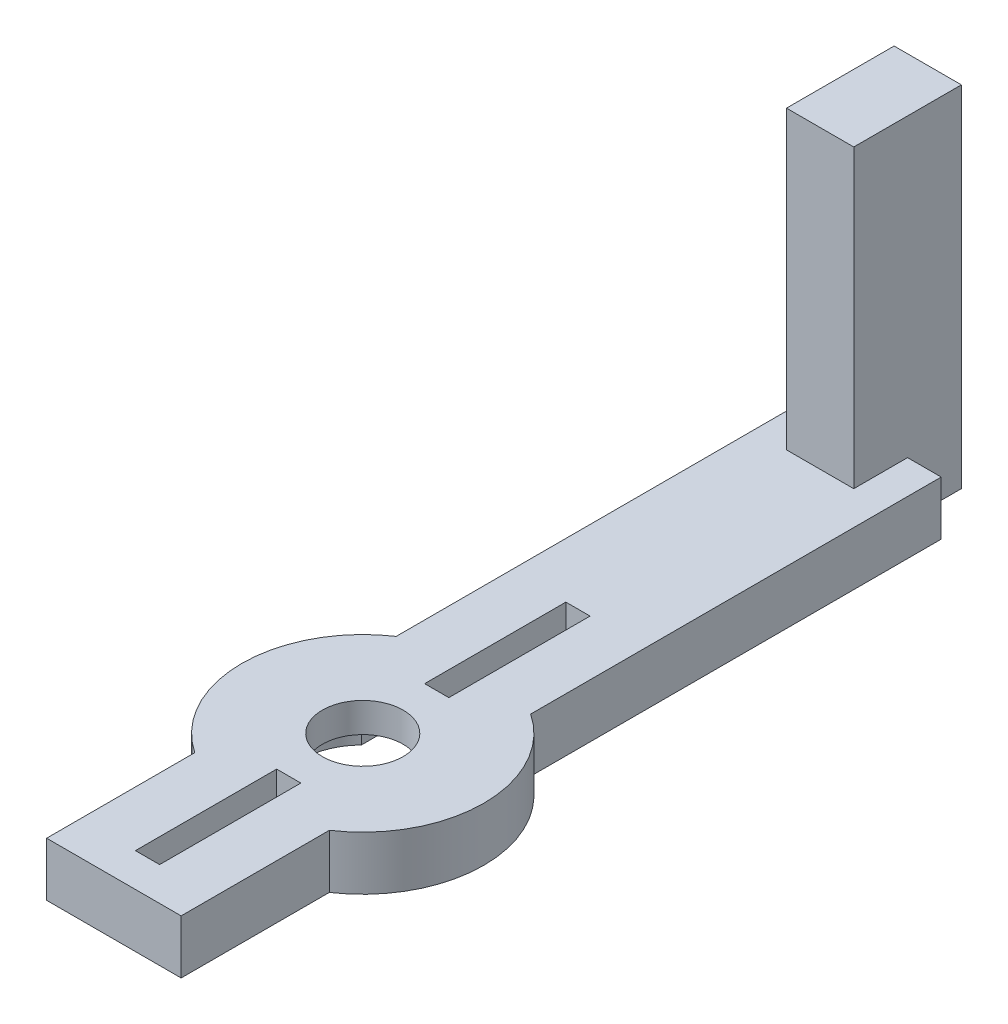
ISO-10303-21;
HEADER;
FILE_DESCRIPTION(('STEP AP214'),'2;1');
FILE_NAME('part.step','',(''),(''),'','','');
FILE_SCHEMA(('AUTOMOTIVE_DESIGN { 1 0 10303 214 1 1 1 1 }'));
ENDSEC;
DATA;
#1=APPLICATION_CONTEXT('core data for automotive mechanical design processes');
#2=APPLICATION_PROTOCOL_DEFINITION('international standard','automotive_design',2000,#1);
#3=PRODUCT_CONTEXT('',#1,'mechanical');
#4=PRODUCT('Part','Part','',(#3));
#5=PRODUCT_RELATED_PRODUCT_CATEGORY('part','',(#4));
#6=PRODUCT_DEFINITION_FORMATION('','',#4);
#7=PRODUCT_DEFINITION_CONTEXT('part definition',#1,'design');
#8=PRODUCT_DEFINITION('design','',#6,#7);
#9=PRODUCT_DEFINITION_SHAPE('','',#8);
#10=(LENGTH_UNIT() NAMED_UNIT(*) SI_UNIT(.MILLI.,.METRE.));
#11=(NAMED_UNIT(*) PLANE_ANGLE_UNIT() SI_UNIT($,.RADIAN.));
#12=(NAMED_UNIT(*) SI_UNIT($,.STERADIAN.) SOLID_ANGLE_UNIT());
#13=UNCERTAINTY_MEASURE_WITH_UNIT(LENGTH_MEASURE(1.E-05),#10,'distance_accuracy_value','');
#14=(GEOMETRIC_REPRESENTATION_CONTEXT(3) GLOBAL_UNCERTAINTY_ASSIGNED_CONTEXT((#13)) GLOBAL_UNIT_ASSIGNED_CONTEXT((#10,
#11,#12)) REPRESENTATION_CONTEXT('',''));
#15=CARTESIAN_POINT('',(0.,0.,0.));
#16=DIRECTION('',(0.,0.,1.));
#17=DIRECTION('',(1.,0.,0.));
#18=AXIS2_PLACEMENT_3D('',#15,#16,#17);
#19=CARTESIAN_POINT('',(0.,67.6,-62.));
#20=DIRECTION('',(0.,1.,0.));
#21=DIRECTION('',(0.,0.,1.));
#22=AXIS2_PLACEMENT_3D('',#19,#20,#21);
#23=PLANE('',#22);
#24=CARTESIAN_POINT('',(0.,67.6,-62.));
#25=DIRECTION('',(0.,1.,0.));
#26=DIRECTION('',(0.,0.,1.));
#27=AXIS2_PLACEMENT_3D('',#24,#25,#26);
#28=CIRCLE('',#27,3.);
#29=CARTESIAN_POINT('',(0.,67.6,-59.));
#30=VERTEX_POINT('',#29);
#31=EDGE_CURVE('E252',#30,#30,#28,.F.);
#32=ORIENTED_EDGE('',*,*,#31,.T.);
#33=EDGE_LOOP('',(#32));
#34=FACE_BOUND('',#33,.T.);
#35=DIRECTION('',(-1.,0.,0.));
#36=VECTOR('',#35,1.);
#37=CARTESIAN_POINT('',(0.,67.6,-96.));
#38=LINE('',#37,#36);
#39=CARTESIAN_POINT('',(2.5,67.6,-96.));
#40=VERTEX_POINT('',#39);
#41=CARTESIAN_POINT('',(-2.5,67.6,-96.));
#42=VERTEX_POINT('',#41);
#43=EDGE_CURVE('E359',#40,#42,#38,.T.);
#44=ORIENTED_EDGE('',*,*,#43,.T.);
#45=DIRECTION('',(0.,0.,-1.));
#46=VECTOR('',#45,1.);
#47=CARTESIAN_POINT('',(-2.5,67.6,-62.));
#48=LINE('',#47,#46);
#49=CARTESIAN_POINT('',(-2.5,67.6,-100.));
#50=VERTEX_POINT('',#49);
#51=EDGE_CURVE('E356',#42,#50,#48,.T.);
#52=ORIENTED_EDGE('',*,*,#51,.T.);
#53=DIRECTION('',(-1.,0.,0.));
#54=VECTOR('',#53,1.);
#55=CARTESIAN_POINT('',(-5.,67.6,-100.));
#56=LINE('',#55,#54);
#57=CARTESIAN_POINT('',(-5.,67.6,-100.));
#58=VERTEX_POINT('',#57);
#59=EDGE_CURVE('E383',#50,#58,#56,.T.);
#60=ORIENTED_EDGE('',*,*,#59,.T.);
#61=DIRECTION('',(0.,0.,-1.));
#62=VECTOR('',#61,1.);
#63=CARTESIAN_POINT('',(-5.,67.6,-43.5));
#64=LINE('',#63,#62);
#65=CARTESIAN_POINT('',(-5.,67.6,-69.4833147735479));
#66=VERTEX_POINT('',#65);
#67=EDGE_CURVE('E373',#66,#58,#64,.T.);
#68=ORIENTED_EDGE('',*,*,#67,.F.);
#69=CARTESIAN_POINT('',(0.,67.6,-62.));
#70=DIRECTION('',(0.,1.,0.));
#71=DIRECTION('',(0.,0.,1.));
#72=AXIS2_PLACEMENT_3D('',#69,#70,#71);
#73=CIRCLE('',#72,9.);
#74=CARTESIAN_POINT('',(-5.,67.6,-54.5166852264521));
#75=VERTEX_POINT('',#74);
#76=EDGE_CURVE('E413',#66,#75,#73,.T.);
#77=ORIENTED_EDGE('',*,*,#76,.T.);
#78=CARTESIAN_POINT('',(-5.,67.6,-43.5));
#79=VERTEX_POINT('',#78);
#80=EDGE_CURVE('E386',#79,#75,#64,.T.);
#81=ORIENTED_EDGE('',*,*,#80,.F.);
#82=DIRECTION('',(-1.,0.,0.));
#83=VECTOR('',#82,1.);
#84=CARTESIAN_POINT('',(-5.,67.6,-43.5));
#85=LINE('',#84,#83);
#86=CARTESIAN_POINT('',(5.,67.6,-43.5));
#87=VERTEX_POINT('',#86);
#88=EDGE_CURVE('E371',#87,#79,#85,.T.);
#89=ORIENTED_EDGE('',*,*,#88,.F.);
#90=DIRECTION('',(0.,0.,-1.));
#91=VECTOR('',#90,1.);
#92=CARTESIAN_POINT('',(5.,67.6,-43.5));
#93=LINE('',#92,#91);
#94=CARTESIAN_POINT('',(5.,67.6,-54.5166852264521));
#95=VERTEX_POINT('',#94);
#96=EDGE_CURVE('E389',#87,#95,#93,.T.);
#97=ORIENTED_EDGE('',*,*,#96,.T.);
#98=CARTESIAN_POINT('',(5.,67.6,-69.4833147735479));
#99=VERTEX_POINT('',#98);
#100=EDGE_CURVE('E409',#95,#99,#73,.T.);
#101=ORIENTED_EDGE('',*,*,#100,.T.);
#102=CARTESIAN_POINT('',(5.,67.6,-100.));
#103=VERTEX_POINT('',#102);
#104=EDGE_CURVE('E388',#99,#103,#93,.T.);
#105=ORIENTED_EDGE('',*,*,#104,.T.);
#106=CARTESIAN_POINT('',(2.5,67.6,-100.));
#107=VERTEX_POINT('',#106);
#108=EDGE_CURVE('E367',#103,#107,#56,.T.);
#109=ORIENTED_EDGE('',*,*,#108,.T.);
#110=DIRECTION('',(0.,0.,1.));
#111=VECTOR('',#110,1.);
#112=CARTESIAN_POINT('',(2.5,67.6,-62.));
#113=LINE('',#112,#111);
#114=EDGE_CURVE('E353',#107,#40,#113,.T.);
#115=ORIENTED_EDGE('',*,*,#114,.T.);
#116=EDGE_LOOP('',(#44,#52,#60,#68,#77,#81,#89,#97,#101,#105,#109,#115));
#117=FACE_BOUND('',#116,.T.);
#118=DIRECTION('',(0.,0.,1.));
#119=VECTOR('',#118,1.);
#120=CARTESIAN_POINT('',(0.9,67.6,-62.));
#121=LINE('',#120,#119);
#122=CARTESIAN_POINT('',(0.9,67.6,-56.5));
#123=VERTEX_POINT('',#122);
#124=CARTESIAN_POINT('',(0.9,67.6,-46.));
#125=VERTEX_POINT('',#124);
#126=EDGE_CURVE('E292',#123,#125,#121,.T.);
#127=ORIENTED_EDGE('',*,*,#126,.T.);
#128=DIRECTION('',(-1.,0.,0.));
#129=VECTOR('',#128,1.);
#130=CARTESIAN_POINT('',(0.,67.6,-46.));
#131=LINE('',#130,#129);
#132=CARTESIAN_POINT('',(-0.9,67.6,-46.));
#133=VERTEX_POINT('',#132);
#134=EDGE_CURVE('E289',#125,#133,#131,.T.);
#135=ORIENTED_EDGE('',*,*,#134,.T.);
#136=DIRECTION('',(0.,0.,-1.));
#137=VECTOR('',#136,1.);
#138=CARTESIAN_POINT('',(-0.9,67.6,-62.));
#139=LINE('',#138,#137);
#140=CARTESIAN_POINT('',(-0.9,67.6,-56.5));
#141=VERTEX_POINT('',#140);
#142=EDGE_CURVE('E295',#133,#141,#139,.T.);
#143=ORIENTED_EDGE('',*,*,#142,.T.);
#144=DIRECTION('',(-1.,0.,0.));
#145=VECTOR('',#144,1.);
#146=CARTESIAN_POINT('',(0.,67.6,-56.5));
#147=LINE('',#146,#145);
#148=EDGE_CURVE('E285',#123,#141,#147,.T.);
#149=ORIENTED_EDGE('',*,*,#148,.F.);
#150=EDGE_LOOP('',(#127,#135,#143,#149));
#151=FACE_BOUND('',#150,.T.);
#152=DIRECTION('',(0.,0.,1.));
#153=VECTOR('',#152,1.);
#154=CARTESIAN_POINT('',(0.9,67.6,-62.));
#155=LINE('',#154,#153);
#156=CARTESIAN_POINT('',(0.9,67.6,-78.));
#157=VERTEX_POINT('',#156);
#158=CARTESIAN_POINT('',(0.9,67.6,-67.5));
#159=VERTEX_POINT('',#158);
#160=EDGE_CURVE('E256',#157,#159,#155,.T.);
#161=ORIENTED_EDGE('',*,*,#160,.T.);
#162=DIRECTION('',(-1.,0.,0.));
#163=VECTOR('',#162,1.);
#164=CARTESIAN_POINT('',(0.,67.6,-67.5));
#165=LINE('',#164,#163);
#166=CARTESIAN_POINT('',(-0.9,67.6,-67.5));
#167=VERTEX_POINT('',#166);
#168=EDGE_CURVE('E242',#159,#167,#165,.T.);
#169=ORIENTED_EDGE('',*,*,#168,.T.);
#170=DIRECTION('',(0.,0.,-1.));
#171=VECTOR('',#170,1.);
#172=CARTESIAN_POINT('',(-0.9,67.6,-62.));
#173=LINE('',#172,#171);
#174=CARTESIAN_POINT('',(-0.9,67.6,-78.));
#175=VERTEX_POINT('',#174);
#176=EDGE_CURVE('E248',#167,#175,#173,.T.);
#177=ORIENTED_EDGE('',*,*,#176,.T.);
#178=DIRECTION('',(-1.,0.,0.));
#179=VECTOR('',#178,1.);
#180=CARTESIAN_POINT('',(0.,67.6,-78.));
#181=LINE('',#180,#179);
#182=EDGE_CURVE('E237',#157,#175,#181,.T.);
#183=ORIENTED_EDGE('',*,*,#182,.F.);
#184=EDGE_LOOP('',(#161,#169,#177,#183));
#185=FACE_BOUND('',#184,.T.);
#186=ADVANCED_FACE('F43',(#34,#117,#151,#185),#23,.T.);
#187=CARTESIAN_POINT('',(0.,65.4,-62.));
#188=DIRECTION('',(0.,1.,0.));
#189=DIRECTION('',(0.,0.,1.));
#190=AXIS2_PLACEMENT_3D('',#187,#188,#189);
#191=PLANE('',#190);
#192=CARTESIAN_POINT('',(0.,65.4,-62.));
#193=DIRECTION('',(0.,1.,0.));
#194=DIRECTION('',(0.,0.,1.));
#195=AXIS2_PLACEMENT_3D('',#192,#193,#194);
#196=CIRCLE('',#195,3.);
#197=CARTESIAN_POINT('',(0.,65.4,-59.));
#198=VERTEX_POINT('',#197);
#199=EDGE_CURVE('E47',#198,#198,#196,.F.);
#200=ORIENTED_EDGE('',*,*,#199,.F.);
#201=EDGE_LOOP('',(#200));
#202=FACE_BOUND('',#201,.T.);
#203=DIRECTION('',(-1.,0.,0.));
#204=VECTOR('',#203,1.);
#205=CARTESIAN_POINT('',(0.,65.4,-46.));
#206=LINE('',#205,#204);
#207=CARTESIAN_POINT('',(0.9,65.4,-46.));
#208=VERTEX_POINT('',#207);
#209=CARTESIAN_POINT('',(-0.9,65.4,-46.));
#210=VERTEX_POINT('',#209);
#211=EDGE_CURVE('E434',#208,#210,#206,.T.);
#212=ORIENTED_EDGE('',*,*,#211,.F.);
#213=DIRECTION('',(0.,0.,1.));
#214=VECTOR('',#213,1.);
#215=CARTESIAN_POINT('',(0.9,65.4,-62.));
#216=LINE('',#215,#214);
#217=CARTESIAN_POINT('',(0.9,65.4,-56.5));
#218=VERTEX_POINT('',#217);
#219=EDGE_CURVE('E429',#218,#208,#216,.T.);
#220=ORIENTED_EDGE('',*,*,#219,.F.);
#221=DIRECTION('',(-1.,0.,0.));
#222=VECTOR('',#221,1.);
#223=CARTESIAN_POINT('',(0.,65.4,-56.5));
#224=LINE('',#223,#222);
#225=CARTESIAN_POINT('',(-0.9,65.4,-56.5));
#226=VERTEX_POINT('',#225);
#227=EDGE_CURVE('E426',#218,#226,#224,.T.);
#228=ORIENTED_EDGE('',*,*,#227,.T.);
#229=DIRECTION('',(0.,0.,-1.));
#230=VECTOR('',#229,1.);
#231=CARTESIAN_POINT('',(-0.9,65.4,-62.));
#232=LINE('',#231,#230);
#233=EDGE_CURVE('E431',#210,#226,#232,.T.);
#234=ORIENTED_EDGE('',*,*,#233,.F.);
#235=EDGE_LOOP('',(#212,#220,#228,#234));
#236=FACE_BOUND('',#235,.T.);
#237=CARTESIAN_POINT('',(0.,65.4,-62.));
#238=DIRECTION('',(0.,1.,0.));
#239=DIRECTION('',(0.,0.,1.));
#240=AXIS2_PLACEMENT_3D('',#237,#238,#239);
#241=CIRCLE('',#240,4.6);
#242=CARTESIAN_POINT('',(-3.3,65.4,-65.2046840717924));
#243=VERTEX_POINT('',#242);
#244=CARTESIAN_POINT('',(-3.3,65.4,-58.7953159282076));
#245=VERTEX_POINT('',#244);
#246=EDGE_CURVE('E320',#243,#245,#241,.T.);
#247=ORIENTED_EDGE('',*,*,#246,.F.);
#248=DIRECTION('',(0.,0.,-1.));
#249=VECTOR('',#248,1.);
#250=CARTESIAN_POINT('',(-3.3,65.4,-62.));
#251=LINE('',#250,#249);
#252=CARTESIAN_POINT('',(-3.3,65.4,-79.5));
#253=VERTEX_POINT('',#252);
#254=EDGE_CURVE('E268',#243,#253,#251,.T.);
#255=ORIENTED_EDGE('',*,*,#254,.T.);
#256=DIRECTION('',(-1.,0.,0.));
#257=VECTOR('',#256,1.);
#258=CARTESIAN_POINT('',(-3.3,65.4,-79.5));
#259=LINE('',#258,#257);
#260=CARTESIAN_POINT('',(3.3,65.4,-79.5));
#261=VERTEX_POINT('',#260);
#262=EDGE_CURVE('E265',#261,#253,#259,.T.);
#263=ORIENTED_EDGE('',*,*,#262,.F.);
#264=DIRECTION('',(0.,0.,-1.));
#265=VECTOR('',#264,1.);
#266=CARTESIAN_POINT('',(3.3,65.4,-62.));
#267=LINE('',#266,#265);
#268=CARTESIAN_POINT('',(3.3,65.4,-65.2046840717924));
#269=VERTEX_POINT('',#268);
#270=EDGE_CURVE('E270',#269,#261,#267,.T.);
#271=ORIENTED_EDGE('',*,*,#270,.F.);
#272=CARTESIAN_POINT('',(3.3,65.4,-58.7953159282076));
#273=VERTEX_POINT('',#272);
#274=EDGE_CURVE('E321',#273,#269,#241,.T.);
#275=ORIENTED_EDGE('',*,*,#274,.F.);
#276=DIRECTION('',(0.,0.,-1.));
#277=VECTOR('',#276,1.);
#278=CARTESIAN_POINT('',(3.3,65.4,-44.5));
#279=LINE('',#278,#277);
#280=CARTESIAN_POINT('',(3.3,65.4,-44.5));
#281=VERTEX_POINT('',#280);
#282=EDGE_CURVE('E308',#281,#273,#279,.T.);
#283=ORIENTED_EDGE('',*,*,#282,.F.);
#284=DIRECTION('',(-1.,0.,0.));
#285=VECTOR('',#284,1.);
#286=CARTESIAN_POINT('',(-3.3,65.4,-44.5));
#287=LINE('',#286,#285);
#288=CARTESIAN_POINT('',(-3.3,65.4,-44.5));
#289=VERTEX_POINT('',#288);
#290=EDGE_CURVE('E303',#281,#289,#287,.T.);
#291=ORIENTED_EDGE('',*,*,#290,.T.);
#292=DIRECTION('',(0.,0.,-1.));
#293=VECTOR('',#292,1.);
#294=CARTESIAN_POINT('',(-3.3,65.4,-44.5));
#295=LINE('',#294,#293);
#296=EDGE_CURVE('E305',#289,#245,#295,.T.);
#297=ORIENTED_EDGE('',*,*,#296,.T.);
#298=EDGE_LOOP('',(#247,#255,#263,#271,#275,#283,#291,#297));
#299=FACE_BOUND('',#298,.T.);
#300=DIRECTION('',(-1.,0.,0.));
#301=VECTOR('',#300,1.);
#302=CARTESIAN_POINT('',(0.,65.4,-67.5));
#303=LINE('',#302,#301);
#304=CARTESIAN_POINT('',(0.9,65.4,-67.5));
#305=VERTEX_POINT('',#304);
#306=CARTESIAN_POINT('',(-0.9,65.4,-67.5));
#307=VERTEX_POINT('',#306);
#308=EDGE_CURVE('E11',#305,#307,#303,.T.);
#309=ORIENTED_EDGE('',*,*,#308,.F.);
#310=DIRECTION('',(0.,0.,1.));
#311=VECTOR('',#310,1.);
#312=CARTESIAN_POINT('',(0.9,65.4,-62.));
#313=LINE('',#312,#311);
#314=CARTESIAN_POINT('',(0.9,65.4,-78.));
#315=VERTEX_POINT('',#314);
#316=EDGE_CURVE('E447',#315,#305,#313,.T.);
#317=ORIENTED_EDGE('',*,*,#316,.F.);
#318=DIRECTION('',(-1.,0.,0.));
#319=VECTOR('',#318,1.);
#320=CARTESIAN_POINT('',(0.,65.4,-78.));
#321=LINE('',#320,#319);
#322=CARTESIAN_POINT('',(-0.9,65.4,-78.));
#323=VERTEX_POINT('',#322);
#324=EDGE_CURVE('E445',#315,#323,#321,.T.);
#325=ORIENTED_EDGE('',*,*,#324,.T.);
#326=DIRECTION('',(0.,0.,-1.));
#327=VECTOR('',#326,1.);
#328=CARTESIAN_POINT('',(-0.9,65.4,-62.));
#329=LINE('',#328,#327);
#330=EDGE_CURVE('E52',#307,#323,#329,.T.);
#331=ORIENTED_EDGE('',*,*,#330,.F.);
#332=EDGE_LOOP('',(#309,#317,#325,#331));
#333=FACE_BOUND('',#332,.T.);
#334=ADVANCED_FACE('F460',(#202,#236,#299,#333),#191,.F.);
#335=CARTESIAN_POINT('',(0.,63.6,-62.));
#336=DIRECTION('',(0.,1.,0.));
#337=DIRECTION('',(0.,0.,1.));
#338=AXIS2_PLACEMENT_3D('',#335,#336,#337);
#339=PLANE('',#338);
#340=DIRECTION('',(1.,0.,0.));
#341=VECTOR('',#340,1.);
#342=CARTESIAN_POINT('',(-5.,63.6,-100.));
#343=LINE('',#342,#341);
#344=CARTESIAN_POINT('',(-5.,63.6,-100.));
#345=VERTEX_POINT('',#344);
#346=CARTESIAN_POINT('',(-2.5,63.6,-100.));
#347=VERTEX_POINT('',#346);
#348=EDGE_CURVE('E377',#345,#347,#343,.T.);
#349=ORIENTED_EDGE('',*,*,#348,.T.);
#350=DIRECTION('',(0.,0.,-1.));
#351=VECTOR('',#350,1.);
#352=CARTESIAN_POINT('',(-2.5,63.6,-96.));
#353=LINE('',#352,#351);
#354=CARTESIAN_POINT('',(-2.5,63.6,-104.));
#355=VERTEX_POINT('',#354);
#356=EDGE_CURVE('E351',#347,#355,#353,.T.);
#357=ORIENTED_EDGE('',*,*,#356,.T.);
#358=DIRECTION('',(1.,0.,0.));
#359=VECTOR('',#358,1.);
#360=CARTESIAN_POINT('',(-2.5,63.6,-104.));
#361=LINE('',#360,#359);
#362=CARTESIAN_POINT('',(2.5,63.6,-104.));
#363=VERTEX_POINT('',#362);
#364=EDGE_CURVE('E337',#355,#363,#361,.T.);
#365=ORIENTED_EDGE('',*,*,#364,.T.);
#366=DIRECTION('',(0.,0.,-1.));
#367=VECTOR('',#366,1.);
#368=CARTESIAN_POINT('',(2.5,63.6,-96.));
#369=LINE('',#368,#367);
#370=CARTESIAN_POINT('',(2.5,63.6,-100.));
#371=VERTEX_POINT('',#370);
#372=EDGE_CURVE('E349',#371,#363,#369,.T.);
#373=ORIENTED_EDGE('',*,*,#372,.F.);
#374=CARTESIAN_POINT('',(5.,63.6,-100.));
#375=VERTEX_POINT('',#374);
#376=EDGE_CURVE('E376',#371,#375,#343,.T.);
#377=ORIENTED_EDGE('',*,*,#376,.T.);
#378=DIRECTION('',(0.,0.,-1.));
#379=VECTOR('',#378,1.);
#380=CARTESIAN_POINT('',(5.,63.6,-43.5));
#381=LINE('',#380,#379);
#382=CARTESIAN_POINT('',(5.,63.6,-69.4833147735479));
#383=VERTEX_POINT('',#382);
#384=EDGE_CURVE('E391',#383,#375,#381,.T.);
#385=ORIENTED_EDGE('',*,*,#384,.F.);
#386=CARTESIAN_POINT('',(0.,63.6,-62.));
#387=DIRECTION('',(0.,1.,0.));
#388=DIRECTION('',(0.,0.,1.));
#389=AXIS2_PLACEMENT_3D('',#386,#387,#388);
#390=CIRCLE('',#389,9.);
#391=CARTESIAN_POINT('',(5.,63.6,-54.5166852264521));
#392=VERTEX_POINT('',#391);
#393=EDGE_CURVE('E414',#392,#383,#390,.T.);
#394=ORIENTED_EDGE('',*,*,#393,.F.);
#395=CARTESIAN_POINT('',(5.,63.6,-43.5));
#396=VERTEX_POINT('',#395);
#397=EDGE_CURVE('E392',#396,#392,#381,.T.);
#398=ORIENTED_EDGE('',*,*,#397,.F.);
#399=DIRECTION('',(1.,0.,0.));
#400=VECTOR('',#399,1.);
#401=CARTESIAN_POINT('',(-5.,63.6,-43.5));
#402=LINE('',#401,#400);
#403=CARTESIAN_POINT('',(-5.,63.6,-43.5));
#404=VERTEX_POINT('',#403);
#405=EDGE_CURVE('E366',#404,#396,#402,.T.);
#406=ORIENTED_EDGE('',*,*,#405,.F.);
#407=DIRECTION('',(0.,0.,-1.));
#408=VECTOR('',#407,1.);
#409=CARTESIAN_POINT('',(-5.,63.6,-43.5));
#410=LINE('',#409,#408);
#411=CARTESIAN_POINT('',(-5.,63.6,-54.5166852264521));
#412=VERTEX_POINT('',#411);
#413=EDGE_CURVE('E395',#404,#412,#410,.T.);
#414=ORIENTED_EDGE('',*,*,#413,.T.);
#415=CARTESIAN_POINT('',(-5.,63.6,-69.4833147735479));
#416=VERTEX_POINT('',#415);
#417=EDGE_CURVE('E408',#416,#412,#390,.T.);
#418=ORIENTED_EDGE('',*,*,#417,.F.);
#419=EDGE_CURVE('E394',#416,#345,#410,.T.);
#420=ORIENTED_EDGE('',*,*,#419,.T.);
#421=EDGE_LOOP('',(#349,#357,#365,#373,#377,#385,#394,#398,#406,#414,#418,#420));
#422=FACE_BOUND('',#421,.T.);
#423=DIRECTION('',(0.,0.,-1.));
#424=VECTOR('',#423,1.);
#425=CARTESIAN_POINT('',(-3.3,63.6,-62.));
#426=LINE('',#425,#424);
#427=CARTESIAN_POINT('',(-3.3,63.6,-65.2046840717924));
#428=VERTEX_POINT('',#427);
#429=CARTESIAN_POINT('',(-3.3,63.6,-79.5));
#430=VERTEX_POINT('',#429);
#431=EDGE_CURVE('E275',#428,#430,#426,.T.);
#432=ORIENTED_EDGE('',*,*,#431,.F.);
#433=CARTESIAN_POINT('',(0.,63.6,-62.));
#434=DIRECTION('',(0.,1.,0.));
#435=DIRECTION('',(0.,0.,1.));
#436=AXIS2_PLACEMENT_3D('',#433,#434,#435);
#437=CIRCLE('',#436,4.6);
#438=CARTESIAN_POINT('',(-3.3,63.6,-58.7953159282076));
#439=VERTEX_POINT('',#438);
#440=EDGE_CURVE('E338',#439,#428,#437,.F.);
#441=ORIENTED_EDGE('',*,*,#440,.F.);
#442=DIRECTION('',(0.,0.,-1.));
#443=VECTOR('',#442,1.);
#444=CARTESIAN_POINT('',(-3.3,63.6,-62.));
#445=LINE('',#444,#443);
#446=CARTESIAN_POINT('',(-3.3,63.6,-44.5));
#447=VERTEX_POINT('',#446);
#448=EDGE_CURVE('E318',#447,#439,#445,.T.);
#449=ORIENTED_EDGE('',*,*,#448,.F.);
#450=DIRECTION('',(-1.,0.,0.));
#451=VECTOR('',#450,1.);
#452=CARTESIAN_POINT('',(0.,63.6,-44.5));
#453=LINE('',#452,#451);
#454=CARTESIAN_POINT('',(3.3,63.6,-44.5));
#455=VERTEX_POINT('',#454);
#456=EDGE_CURVE('E422',#455,#447,#453,.T.);
#457=ORIENTED_EDGE('',*,*,#456,.F.);
#458=DIRECTION('',(0.,0.,1.));
#459=VECTOR('',#458,1.);
#460=CARTESIAN_POINT('',(3.3,63.6,-62.));
#461=LINE('',#460,#459);
#462=CARTESIAN_POINT('',(3.3,63.6,-58.7953159282076));
#463=VERTEX_POINT('',#462);
#464=EDGE_CURVE('E313',#463,#455,#461,.T.);
#465=ORIENTED_EDGE('',*,*,#464,.F.);
#466=CARTESIAN_POINT('',(3.3,63.6,-65.2046840717924));
#467=VERTEX_POINT('',#466);
#468=EDGE_CURVE('E324',#467,#463,#437,.F.);
#469=ORIENTED_EDGE('',*,*,#468,.F.);
#470=DIRECTION('',(0.,0.,1.));
#471=VECTOR('',#470,1.);
#472=CARTESIAN_POINT('',(3.3,63.6,-62.));
#473=LINE('',#472,#471);
#474=CARTESIAN_POINT('',(3.3,63.6,-79.5));
#475=VERTEX_POINT('',#474);
#476=EDGE_CURVE('E273',#475,#467,#473,.T.);
#477=ORIENTED_EDGE('',*,*,#476,.F.);
#478=DIRECTION('',(-1.,0.,0.));
#479=VECTOR('',#478,1.);
#480=CARTESIAN_POINT('',(0.,63.6,-79.5));
#481=LINE('',#480,#479);
#482=EDGE_CURVE('E442',#475,#430,#481,.T.);
#483=ORIENTED_EDGE('',*,*,#482,.T.);
#484=EDGE_LOOP('',(#432,#441,#449,#457,#465,#469,#477,#483));
#485=FACE_BOUND('',#484,.T.);
#486=ADVANCED_FACE('F462',(#422,#485),#339,.F.);
#487=CARTESIAN_POINT('',(0.,65.4,-62.));
#488=DIRECTION('',(0.,-1.,0.));
#489=DIRECTION('',(0.,0.,-1.));
#490=AXIS2_PLACEMENT_3D('',#487,#488,#489);
#491=CYLINDRICAL_SURFACE('',#490,4.6);
#492=ORIENTED_EDGE('',*,*,#440,.T.);
#493=DIRECTION('',(0.,-1.,0.));
#494=VECTOR('',#493,1.);
#495=CARTESIAN_POINT('',(-3.3,65.4,-65.2046840717924));
#496=LINE('',#495,#494);
#497=EDGE_CURVE('E439',#428,#243,#496,.F.);
#498=ORIENTED_EDGE('',*,*,#497,.T.);
#499=ORIENTED_EDGE('',*,*,#246,.T.);
#500=DIRECTION('',(0.,-1.,0.));
#501=VECTOR('',#500,1.);
#502=CARTESIAN_POINT('',(-3.3,65.4,-58.7953159282076));
#503=LINE('',#502,#501);
#504=EDGE_CURVE('E315',#245,#439,#503,.T.);
#505=ORIENTED_EDGE('',*,*,#504,.T.);
#506=EDGE_LOOP('',(#492,#498,#499,#505));
#507=FACE_BOUND('',#506,.T.);
#508=ADVANCED_FACE('F469',(#507),#491,.F.);
#509=ORIENTED_EDGE('',*,*,#274,.T.);
#510=DIRECTION('',(0.,-1.,0.));
#511=VECTOR('',#510,1.);
#512=CARTESIAN_POINT('',(3.3,65.4,-65.2046840717924));
#513=LINE('',#512,#511);
#514=EDGE_CURVE('E436',#269,#467,#513,.T.);
#515=ORIENTED_EDGE('',*,*,#514,.T.);
#516=ORIENTED_EDGE('',*,*,#468,.T.);
#517=DIRECTION('',(0.,-1.,0.));
#518=VECTOR('',#517,1.);
#519=CARTESIAN_POINT('',(3.3,65.4,-58.7953159282076));
#520=LINE('',#519,#518);
#521=EDGE_CURVE('E310',#463,#273,#520,.F.);
#522=ORIENTED_EDGE('',*,*,#521,.T.);
#523=EDGE_LOOP('',(#509,#515,#516,#522));
#524=FACE_BOUND('',#523,.T.);
#525=ADVANCED_FACE('F481',(#524),#491,.F.);
#526=CARTESIAN_POINT('',(0.,0.,-100.));
#527=DIRECTION('',(0.,0.,-1.));
#528=DIRECTION('',(-1.,0.,0.));
#529=AXIS2_PLACEMENT_3D('',#526,#527,#528);
#530=PLANE('',#529);
#531=ORIENTED_EDGE('',*,*,#59,.F.);
#532=DIRECTION('',(0.,-1.,0.));
#533=VECTOR('',#532,1.);
#534=CARTESIAN_POINT('',(-2.5,0.,-100.));
#535=LINE('',#534,#533);
#536=EDGE_CURVE('E419',#50,#347,#535,.T.);
#537=ORIENTED_EDGE('',*,*,#536,.T.);
#538=ORIENTED_EDGE('',*,*,#348,.F.);
#539=DIRECTION('',(0.,-1.,0.));
#540=VECTOR('',#539,1.);
#541=CARTESIAN_POINT('',(-5.,63.6,-100.));
#542=LINE('',#541,#540);
#543=EDGE_CURVE('E362',#58,#345,#542,.T.);
#544=ORIENTED_EDGE('',*,*,#543,.F.);
#545=EDGE_LOOP('',(#531,#537,#538,#544));
#546=FACE_BOUND('',#545,.T.);
#547=ADVANCED_FACE('F509',(#546),#530,.T.);
#548=ORIENTED_EDGE('',*,*,#376,.F.);
#549=DIRECTION('',(0.,1.,0.));
#550=VECTOR('',#549,1.);
#551=CARTESIAN_POINT('',(2.5,0.,-100.));
#552=LINE('',#551,#550);
#553=EDGE_CURVE('E412',#371,#107,#552,.T.);
#554=ORIENTED_EDGE('',*,*,#553,.T.);
#555=ORIENTED_EDGE('',*,*,#108,.F.);
#556=DIRECTION('',(0.,1.,0.));
#557=VECTOR('',#556,1.);
#558=CARTESIAN_POINT('',(5.,63.6,-100.));
#559=LINE('',#558,#557);
#560=EDGE_CURVE('E380',#375,#103,#559,.T.);
#561=ORIENTED_EDGE('',*,*,#560,.F.);
#562=EDGE_LOOP('',(#548,#554,#555,#561));
#563=FACE_BOUND('',#562,.T.);
#564=ADVANCED_FACE('F512',(#563),#530,.T.);
#565=CARTESIAN_POINT('',(0.,67.6,-62.));
#566=DIRECTION('',(0.,-1.,0.));
#567=DIRECTION('',(0.,0.,-1.));
#568=AXIS2_PLACEMENT_3D('',#565,#566,#567);
#569=CYLINDRICAL_SURFACE('',#568,9.);
#570=DIRECTION('',(0.,-1.,0.));
#571=VECTOR('',#570,1.);
#572=CARTESIAN_POINT('',(-5.,67.6,-54.5166852264521));
#573=LINE('',#572,#571);
#574=EDGE_CURVE('E406',#75,#412,#573,.T.);
#575=ORIENTED_EDGE('',*,*,#574,.F.);
#576=ORIENTED_EDGE('',*,*,#76,.F.);
#577=DIRECTION('',(0.,-1.,0.));
#578=VECTOR('',#577,1.);
#579=CARTESIAN_POINT('',(-5.,67.6,-69.4833147735479));
#580=LINE('',#579,#578);
#581=EDGE_CURVE('E403',#416,#66,#580,.F.);
#582=ORIENTED_EDGE('',*,*,#581,.F.);
#583=ORIENTED_EDGE('',*,*,#417,.T.);
#584=EDGE_LOOP('',(#575,#576,#582,#583));
#585=FACE_BOUND('',#584,.T.);
#586=ADVANCED_FACE('F45',(#585),#569,.T.);
#587=DIRECTION('',(0.,-1.,0.));
#588=VECTOR('',#587,1.);
#589=CARTESIAN_POINT('',(5.,67.6,-69.4833147735479));
#590=LINE('',#589,#588);
#591=EDGE_CURVE('E401',#99,#383,#590,.T.);
#592=ORIENTED_EDGE('',*,*,#591,.F.);
#593=ORIENTED_EDGE('',*,*,#100,.F.);
#594=DIRECTION('',(0.,-1.,0.));
#595=VECTOR('',#594,1.);
#596=CARTESIAN_POINT('',(5.,67.6,-54.5166852264521));
#597=LINE('',#596,#595);
#598=EDGE_CURVE('E398',#392,#95,#597,.F.);
#599=ORIENTED_EDGE('',*,*,#598,.F.);
#600=ORIENTED_EDGE('',*,*,#393,.T.);
#601=EDGE_LOOP('',(#592,#593,#599,#600));
#602=FACE_BOUND('',#601,.T.);
#603=ADVANCED_FACE('F518',(#602),#569,.T.);
#604=CARTESIAN_POINT('',(5.,63.6,-43.5));
#605=DIRECTION('',(-1.,0.,0.));
#606=DIRECTION('',(0.,0.,1.));
#607=AXIS2_PLACEMENT_3D('',#604,#605,#606);
#608=PLANE('',#607);
#609=ORIENTED_EDGE('',*,*,#104,.F.);
#610=ORIENTED_EDGE('',*,*,#591,.T.);
#611=ORIENTED_EDGE('',*,*,#384,.T.);
#612=ORIENTED_EDGE('',*,*,#560,.T.);
#613=EDGE_LOOP('',(#609,#610,#611,#612));
#614=FACE_BOUND('',#613,.T.);
#615=ADVANCED_FACE('F514',(#614),#608,.F.);
#616=CARTESIAN_POINT('',(-5.,63.6,-43.5));
#617=DIRECTION('',(1.,0.,0.));
#618=DIRECTION('',(0.,0.,-1.));
#619=AXIS2_PLACEMENT_3D('',#616,#617,#618);
#620=PLANE('',#619);
#621=ORIENTED_EDGE('',*,*,#419,.F.);
#622=ORIENTED_EDGE('',*,*,#581,.T.);
#623=ORIENTED_EDGE('',*,*,#67,.T.);
#624=ORIENTED_EDGE('',*,*,#543,.T.);
#625=EDGE_LOOP('',(#621,#622,#623,#624));
#626=FACE_BOUND('',#625,.T.);
#627=ADVANCED_FACE('F517',(#626),#620,.F.);
#628=ORIENTED_EDGE('',*,*,#80,.T.);
#629=ORIENTED_EDGE('',*,*,#574,.T.);
#630=ORIENTED_EDGE('',*,*,#413,.F.);
#631=DIRECTION('',(0.,-1.,0.));
#632=VECTOR('',#631,1.);
#633=CARTESIAN_POINT('',(-5.,63.6,-43.5));
#634=LINE('',#633,#632);
#635=EDGE_CURVE('E363',#79,#404,#634,.T.);
#636=ORIENTED_EDGE('',*,*,#635,.F.);
#637=EDGE_LOOP('',(#628,#629,#630,#636));
#638=FACE_BOUND('',#637,.T.);
#639=ADVANCED_FACE('F520',(#638),#620,.F.);
#640=ORIENTED_EDGE('',*,*,#397,.T.);
#641=ORIENTED_EDGE('',*,*,#598,.T.);
#642=ORIENTED_EDGE('',*,*,#96,.F.);
#643=DIRECTION('',(0.,1.,0.));
#644=VECTOR('',#643,1.);
#645=CARTESIAN_POINT('',(5.,63.6,-43.5));
#646=LINE('',#645,#644);
#647=EDGE_CURVE('E369',#396,#87,#646,.T.);
#648=ORIENTED_EDGE('',*,*,#647,.F.);
#649=EDGE_LOOP('',(#640,#641,#642,#648));
#650=FACE_BOUND('',#649,.T.);
#651=ADVANCED_FACE('F507',(#650),#608,.F.);
#652=CARTESIAN_POINT('',(0.,0.,-43.5));
#653=DIRECTION('',(0.,0.,-1.));
#654=DIRECTION('',(-1.,0.,0.));
#655=AXIS2_PLACEMENT_3D('',#652,#653,#654);
#656=PLANE('',#655);
#657=ORIENTED_EDGE('',*,*,#635,.T.);
#658=ORIENTED_EDGE('',*,*,#405,.T.);
#659=ORIENTED_EDGE('',*,*,#647,.T.);
#660=ORIENTED_EDGE('',*,*,#88,.T.);
#661=EDGE_LOOP('',(#657,#658,#659,#660));
#662=FACE_BOUND('',#661,.T.);
#663=ADVANCED_FACE('F503',(#662),#656,.F.);
#664=CARTESIAN_POINT('',(-2.5,63.6,-96.));
#665=DIRECTION('',(1.,0.,0.));
#666=DIRECTION('',(0.,0.,-1.));
#667=AXIS2_PLACEMENT_3D('',#664,#665,#666);
#668=PLANE('',#667);
#669=ORIENTED_EDGE('',*,*,#51,.F.);
#670=DIRECTION('',(0.,-1.,0.));
#671=VECTOR('',#670,1.);
#672=CARTESIAN_POINT('',(-2.5,63.6,-96.));
#673=LINE('',#672,#671);
#674=CARTESIAN_POINT('',(-2.5,89.6,-96.));
#675=VERTEX_POINT('',#674);
#676=EDGE_CURVE('E325',#675,#42,#673,.T.);
#677=ORIENTED_EDGE('',*,*,#676,.F.);
#678=DIRECTION('',(0.,0.,-1.));
#679=VECTOR('',#678,1.);
#680=CARTESIAN_POINT('',(-2.5,89.6,-96.));
#681=LINE('',#680,#679);
#682=CARTESIAN_POINT('',(-2.5,89.6,-104.));
#683=VERTEX_POINT('',#682);
#684=EDGE_CURVE('E333',#675,#683,#681,.T.);
#685=ORIENTED_EDGE('',*,*,#684,.T.);
#686=DIRECTION('',(0.,-1.,0.));
#687=VECTOR('',#686,1.);
#688=CARTESIAN_POINT('',(-2.5,63.6,-104.));
#689=LINE('',#688,#687);
#690=EDGE_CURVE('E334',#683,#355,#689,.T.);
#691=ORIENTED_EDGE('',*,*,#690,.T.);
#692=ORIENTED_EDGE('',*,*,#356,.F.);
#693=ORIENTED_EDGE('',*,*,#536,.F.);
#694=EDGE_LOOP('',(#669,#677,#685,#691,#692,#693));
#695=FACE_BOUND('',#694,.T.);
#696=ADVANCED_FACE('F499',(#695),#668,.F.);
#697=CARTESIAN_POINT('',(2.5,63.6,-96.));
#698=DIRECTION('',(-1.,0.,0.));
#699=DIRECTION('',(0.,0.,1.));
#700=AXIS2_PLACEMENT_3D('',#697,#698,#699);
#701=PLANE('',#700);
#702=ORIENTED_EDGE('',*,*,#114,.F.);
#703=ORIENTED_EDGE('',*,*,#553,.F.);
#704=ORIENTED_EDGE('',*,*,#372,.T.);
#705=DIRECTION('',(0.,1.,0.));
#706=VECTOR('',#705,1.);
#707=CARTESIAN_POINT('',(2.5,63.6,-104.));
#708=LINE('',#707,#706);
#709=CARTESIAN_POINT('',(2.5,89.6,-104.));
#710=VERTEX_POINT('',#709);
#711=EDGE_CURVE('E341',#363,#710,#708,.T.);
#712=ORIENTED_EDGE('',*,*,#711,.T.);
#713=DIRECTION('',(0.,0.,-1.));
#714=VECTOR('',#713,1.);
#715=CARTESIAN_POINT('',(2.5,89.6,-96.));
#716=LINE('',#715,#714);
#717=CARTESIAN_POINT('',(2.5,89.6,-96.));
#718=VERTEX_POINT('',#717);
#719=EDGE_CURVE('E346',#718,#710,#716,.T.);
#720=ORIENTED_EDGE('',*,*,#719,.F.);
#721=DIRECTION('',(0.,1.,0.));
#722=VECTOR('',#721,1.);
#723=CARTESIAN_POINT('',(2.5,63.6,-96.));
#724=LINE('',#723,#722);
#725=EDGE_CURVE('E328',#40,#718,#724,.T.);
#726=ORIENTED_EDGE('',*,*,#725,.F.);
#727=EDGE_LOOP('',(#702,#703,#704,#712,#720,#726));
#728=FACE_BOUND('',#727,.T.);
#729=ADVANCED_FACE('F495',(#728),#701,.F.);
#730=CARTESIAN_POINT('',(-2.5,89.6,-96.));
#731=DIRECTION('',(0.,-1.,0.));
#732=DIRECTION('',(0.,0.,-1.));
#733=AXIS2_PLACEMENT_3D('',#730,#731,#732);
#734=PLANE('',#733);
#735=DIRECTION('',(-1.,0.,0.));
#736=VECTOR('',#735,1.);
#737=CARTESIAN_POINT('',(-2.5,89.6,-104.));
#738=LINE('',#737,#736);
#739=EDGE_CURVE('E329',#710,#683,#738,.T.);
#740=ORIENTED_EDGE('',*,*,#739,.T.);
#741=ORIENTED_EDGE('',*,*,#684,.F.);
#742=DIRECTION('',(-1.,0.,0.));
#743=VECTOR('',#742,1.);
#744=CARTESIAN_POINT('',(-2.5,89.6,-96.));
#745=LINE('',#744,#743);
#746=EDGE_CURVE('E331',#718,#675,#745,.T.);
#747=ORIENTED_EDGE('',*,*,#746,.F.);
#748=ORIENTED_EDGE('',*,*,#719,.T.);
#749=EDGE_LOOP('',(#740,#741,#747,#748));
#750=FACE_BOUND('',#749,.T.);
#751=ADVANCED_FACE('F487',(#750),#734,.F.);
#752=CARTESIAN_POINT('',(0.,0.,-96.));
#753=DIRECTION('',(0.,0.,-1.));
#754=DIRECTION('',(-1.,0.,0.));
#755=AXIS2_PLACEMENT_3D('',#752,#753,#754);
#756=PLANE('',#755);
#757=ORIENTED_EDGE('',*,*,#43,.F.);
#758=ORIENTED_EDGE('',*,*,#725,.T.);
#759=ORIENTED_EDGE('',*,*,#746,.T.);
#760=ORIENTED_EDGE('',*,*,#676,.T.);
#761=EDGE_LOOP('',(#757,#758,#759,#760));
#762=FACE_BOUND('',#761,.T.);
#763=ADVANCED_FACE('F483',(#762),#756,.F.);
#764=CARTESIAN_POINT('',(0.,0.,-104.));
#765=DIRECTION('',(0.,0.,-1.));
#766=DIRECTION('',(-1.,0.,0.));
#767=AXIS2_PLACEMENT_3D('',#764,#765,#766);
#768=PLANE('',#767);
#769=ORIENTED_EDGE('',*,*,#690,.F.);
#770=ORIENTED_EDGE('',*,*,#739,.F.);
#771=ORIENTED_EDGE('',*,*,#711,.F.);
#772=ORIENTED_EDGE('',*,*,#364,.F.);
#773=EDGE_LOOP('',(#769,#770,#771,#772));
#774=FACE_BOUND('',#773,.T.);
#775=ADVANCED_FACE('F486',(#774),#768,.T.);
#776=CARTESIAN_POINT('',(0.,0.,-44.5));
#777=DIRECTION('',(0.,0.,-1.));
#778=DIRECTION('',(-1.,0.,0.));
#779=AXIS2_PLACEMENT_3D('',#776,#777,#778);
#780=PLANE('',#779);
#781=ORIENTED_EDGE('',*,*,#456,.T.);
#782=DIRECTION('',(0.,-1.,0.));
#783=VECTOR('',#782,1.);
#784=CARTESIAN_POINT('',(-3.3,63.1,-44.5));
#785=LINE('',#784,#783);
#786=EDGE_CURVE('E298',#289,#447,#785,.T.);
#787=ORIENTED_EDGE('',*,*,#786,.F.);
#788=ORIENTED_EDGE('',*,*,#290,.F.);
#789=DIRECTION('',(0.,1.,0.));
#790=VECTOR('',#789,1.);
#791=CARTESIAN_POINT('',(3.3,63.1,-44.5));
#792=LINE('',#791,#790);
#793=EDGE_CURVE('E301',#455,#281,#792,.T.);
#794=ORIENTED_EDGE('',*,*,#793,.F.);
#795=EDGE_LOOP('',(#781,#787,#788,#794));
#796=FACE_BOUND('',#795,.T.);
#797=ADVANCED_FACE('F491',(#796),#780,.T.);
#798=CARTESIAN_POINT('',(-3.3,63.1,-44.5));
#799=DIRECTION('',(1.,0.,0.));
#800=DIRECTION('',(0.,0.,-1.));
#801=AXIS2_PLACEMENT_3D('',#798,#799,#800);
#802=PLANE('',#801);
#803=ORIENTED_EDGE('',*,*,#448,.T.);
#804=ORIENTED_EDGE('',*,*,#504,.F.);
#805=ORIENTED_EDGE('',*,*,#296,.F.);
#806=ORIENTED_EDGE('',*,*,#786,.T.);
#807=EDGE_LOOP('',(#803,#804,#805,#806));
#808=FACE_BOUND('',#807,.T.);
#809=ADVANCED_FACE('F477',(#808),#802,.T.);
#810=CARTESIAN_POINT('',(3.3,63.1,-44.5));
#811=DIRECTION('',(-1.,0.,0.));
#812=DIRECTION('',(0.,0.,1.));
#813=AXIS2_PLACEMENT_3D('',#810,#811,#812);
#814=PLANE('',#813);
#815=ORIENTED_EDGE('',*,*,#464,.T.);
#816=ORIENTED_EDGE('',*,*,#793,.T.);
#817=ORIENTED_EDGE('',*,*,#282,.T.);
#818=ORIENTED_EDGE('',*,*,#521,.F.);
#819=EDGE_LOOP('',(#815,#816,#817,#818));
#820=FACE_BOUND('',#819,.T.);
#821=ADVANCED_FACE('F656',(#820),#814,.T.);
#822=CARTESIAN_POINT('',(-0.9,62.6,-46.));
#823=DIRECTION('',(1.,0.,0.));
#824=DIRECTION('',(0.,0.,-1.));
#825=AXIS2_PLACEMENT_3D('',#822,#823,#824);
#826=PLANE('',#825);
#827=DIRECTION('',(0.,-1.,0.));
#828=VECTOR('',#827,1.);
#829=CARTESIAN_POINT('',(-0.9,62.6,-46.));
#830=LINE('',#829,#828);
#831=EDGE_CURVE('E278',#133,#210,#830,.T.);
#832=ORIENTED_EDGE('',*,*,#831,.T.);
#833=ORIENTED_EDGE('',*,*,#233,.T.);
#834=DIRECTION('',(0.,-1.,0.));
#835=VECTOR('',#834,1.);
#836=CARTESIAN_POINT('',(-0.9,62.6,-56.5));
#837=LINE('',#836,#835);
#838=EDGE_CURVE('E277',#141,#226,#837,.T.);
#839=ORIENTED_EDGE('',*,*,#838,.F.);
#840=ORIENTED_EDGE('',*,*,#142,.F.);
#841=EDGE_LOOP('',(#832,#833,#839,#840));
#842=FACE_BOUND('',#841,.T.);
#843=ADVANCED_FACE('F663',(#842),#826,.T.);
#844=CARTESIAN_POINT('',(0.9,62.6,-46.));
#845=DIRECTION('',(-1.,0.,0.));
#846=DIRECTION('',(0.,0.,1.));
#847=AXIS2_PLACEMENT_3D('',#844,#845,#846);
#848=PLANE('',#847);
#849=DIRECTION('',(0.,1.,0.));
#850=VECTOR('',#849,1.);
#851=CARTESIAN_POINT('',(0.9,62.6,-56.5));
#852=LINE('',#851,#850);
#853=EDGE_CURVE('E282',#218,#123,#852,.T.);
#854=ORIENTED_EDGE('',*,*,#853,.F.);
#855=ORIENTED_EDGE('',*,*,#219,.T.);
#856=DIRECTION('',(0.,1.,0.));
#857=VECTOR('',#856,1.);
#858=CARTESIAN_POINT('',(0.9,62.6,-46.));
#859=LINE('',#858,#857);
#860=EDGE_CURVE('E281',#208,#125,#859,.T.);
#861=ORIENTED_EDGE('',*,*,#860,.T.);
#862=ORIENTED_EDGE('',*,*,#126,.F.);
#863=EDGE_LOOP('',(#854,#855,#861,#862));
#864=FACE_BOUND('',#863,.T.);
#865=ADVANCED_FACE('F681',(#864),#848,.T.);
#866=CARTESIAN_POINT('',(0.,0.,-46.));
#867=DIRECTION('',(0.,0.,-1.));
#868=DIRECTION('',(-1.,0.,0.));
#869=AXIS2_PLACEMENT_3D('',#866,#867,#868);
#870=PLANE('',#869);
#871=ORIENTED_EDGE('',*,*,#860,.F.);
#872=ORIENTED_EDGE('',*,*,#211,.T.);
#873=ORIENTED_EDGE('',*,*,#831,.F.);
#874=ORIENTED_EDGE('',*,*,#134,.F.);
#875=EDGE_LOOP('',(#871,#872,#873,#874));
#876=FACE_BOUND('',#875,.T.);
#877=ADVANCED_FACE('F692',(#876),#870,.T.);
#878=CARTESIAN_POINT('',(0.,0.,-56.5));
#879=DIRECTION('',(0.,0.,-1.));
#880=DIRECTION('',(-1.,0.,0.));
#881=AXIS2_PLACEMENT_3D('',#878,#879,#880);
#882=PLANE('',#881);
#883=ORIENTED_EDGE('',*,*,#148,.T.);
#884=ORIENTED_EDGE('',*,*,#838,.T.);
#885=ORIENTED_EDGE('',*,*,#227,.F.);
#886=ORIENTED_EDGE('',*,*,#853,.T.);
#887=EDGE_LOOP('',(#883,#884,#885,#886));
#888=FACE_BOUND('',#887,.T.);
#889=ADVANCED_FACE('F640',(#888),#882,.F.);
#890=CARTESIAN_POINT('',(0.,0.,-79.5));
#891=DIRECTION('',(0.,0.,-1.));
#892=DIRECTION('',(-1.,0.,0.));
#893=AXIS2_PLACEMENT_3D('',#890,#891,#892);
#894=PLANE('',#893);
#895=DIRECTION('',(0.,1.,0.));
#896=VECTOR('',#895,1.);
#897=CARTESIAN_POINT('',(3.3,63.1,-79.5));
#898=LINE('',#897,#896);
#899=EDGE_CURVE('E259',#475,#261,#898,.T.);
#900=ORIENTED_EDGE('',*,*,#899,.T.);
#901=ORIENTED_EDGE('',*,*,#262,.T.);
#902=DIRECTION('',(0.,-1.,0.));
#903=VECTOR('',#902,1.);
#904=CARTESIAN_POINT('',(-3.3,63.1,-79.5));
#905=LINE('',#904,#903);
#906=EDGE_CURVE('E255',#253,#430,#905,.T.);
#907=ORIENTED_EDGE('',*,*,#906,.T.);
#908=ORIENTED_EDGE('',*,*,#482,.F.);
#909=EDGE_LOOP('',(#900,#901,#907,#908));
#910=FACE_BOUND('',#909,.T.);
#911=ADVANCED_FACE('F631',(#910),#894,.F.);
#912=CARTESIAN_POINT('',(-3.3,63.1,-62.));
#913=DIRECTION('',(1.,0.,0.));
#914=DIRECTION('',(0.,0.,-1.));
#915=AXIS2_PLACEMENT_3D('',#912,#913,#914);
#916=PLANE('',#915);
#917=ORIENTED_EDGE('',*,*,#431,.T.);
#918=ORIENTED_EDGE('',*,*,#906,.F.);
#919=ORIENTED_EDGE('',*,*,#254,.F.);
#920=ORIENTED_EDGE('',*,*,#497,.F.);
#921=EDGE_LOOP('',(#917,#918,#919,#920));
#922=FACE_BOUND('',#921,.T.);
#923=ADVANCED_FACE('F622',(#922),#916,.T.);
#924=CARTESIAN_POINT('',(3.3,63.1,-62.));
#925=DIRECTION('',(-1.,0.,0.));
#926=DIRECTION('',(0.,0.,1.));
#927=AXIS2_PLACEMENT_3D('',#924,#925,#926);
#928=PLANE('',#927);
#929=ORIENTED_EDGE('',*,*,#476,.T.);
#930=ORIENTED_EDGE('',*,*,#514,.F.);
#931=ORIENTED_EDGE('',*,*,#270,.T.);
#932=ORIENTED_EDGE('',*,*,#899,.F.);
#933=EDGE_LOOP('',(#929,#930,#931,#932));
#934=FACE_BOUND('',#933,.T.);
#935=ADVANCED_FACE('F589',(#934),#928,.T.);
#936=CARTESIAN_POINT('',(-0.9,62.6,-67.5));
#937=DIRECTION('',(1.,0.,0.));
#938=DIRECTION('',(0.,0.,-1.));
#939=AXIS2_PLACEMENT_3D('',#936,#937,#938);
#940=PLANE('',#939);
#941=DIRECTION('',(0.,-1.,0.));
#942=VECTOR('',#941,1.);
#943=CARTESIAN_POINT('',(-0.9,62.6,-67.5));
#944=LINE('',#943,#942);
#945=EDGE_CURVE('E458',#167,#307,#944,.T.);
#946=ORIENTED_EDGE('',*,*,#945,.T.);
#947=ORIENTED_EDGE('',*,*,#330,.T.);
#948=DIRECTION('',(0.,-1.,0.));
#949=VECTOR('',#948,1.);
#950=CARTESIAN_POINT('',(-0.9,62.6,-78.));
#951=LINE('',#950,#949);
#952=EDGE_CURVE('E64',#175,#323,#951,.T.);
#953=ORIENTED_EDGE('',*,*,#952,.F.);
#954=ORIENTED_EDGE('',*,*,#176,.F.);
#955=EDGE_LOOP('',(#946,#947,#953,#954));
#956=FACE_BOUND('',#955,.T.);
#957=ADVANCED_FACE('F247',(#956),#940,.T.);
#958=CARTESIAN_POINT('',(0.9,62.6,-67.5));
#959=DIRECTION('',(-1.,0.,0.));
#960=DIRECTION('',(0.,0.,1.));
#961=AXIS2_PLACEMENT_3D('',#958,#959,#960);
#962=PLANE('',#961);
#963=DIRECTION('',(0.,1.,0.));
#964=VECTOR('',#963,1.);
#965=CARTESIAN_POINT('',(0.9,62.6,-78.));
#966=LINE('',#965,#964);
#967=EDGE_CURVE('E59',#315,#157,#966,.T.);
#968=ORIENTED_EDGE('',*,*,#967,.F.);
#969=ORIENTED_EDGE('',*,*,#316,.T.);
#970=DIRECTION('',(0.,1.,0.));
#971=VECTOR('',#970,1.);
#972=CARTESIAN_POINT('',(0.9,62.6,-67.5));
#973=LINE('',#972,#971);
#974=EDGE_CURVE('E243',#305,#159,#973,.T.);
#975=ORIENTED_EDGE('',*,*,#974,.T.);
#976=ORIENTED_EDGE('',*,*,#160,.F.);
#977=EDGE_LOOP('',(#968,#969,#975,#976));
#978=FACE_BOUND('',#977,.T.);
#979=ADVANCED_FACE('F453',(#978),#962,.T.);
#980=CARTESIAN_POINT('',(0.,0.,-67.5));
#981=DIRECTION('',(0.,0.,-1.));
#982=DIRECTION('',(-1.,0.,0.));
#983=AXIS2_PLACEMENT_3D('',#980,#981,#982);
#984=PLANE('',#983);
#985=ORIENTED_EDGE('',*,*,#974,.F.);
#986=ORIENTED_EDGE('',*,*,#308,.T.);
#987=ORIENTED_EDGE('',*,*,#945,.F.);
#988=ORIENTED_EDGE('',*,*,#168,.F.);
#989=EDGE_LOOP('',(#985,#986,#987,#988));
#990=FACE_BOUND('',#989,.T.);
#991=ADVANCED_FACE('F457',(#990),#984,.T.);
#992=CARTESIAN_POINT('',(0.,0.,-78.));
#993=DIRECTION('',(0.,0.,-1.));
#994=DIRECTION('',(-1.,0.,0.));
#995=AXIS2_PLACEMENT_3D('',#992,#993,#994);
#996=PLANE('',#995);
#997=ORIENTED_EDGE('',*,*,#182,.T.);
#998=ORIENTED_EDGE('',*,*,#952,.T.);
#999=ORIENTED_EDGE('',*,*,#324,.F.);
#1000=ORIENTED_EDGE('',*,*,#967,.T.);
#1001=EDGE_LOOP('',(#997,#998,#999,#1000));
#1002=FACE_BOUND('',#1001,.T.);
#1003=ADVANCED_FACE('F238',(#1002),#996,.F.);
#1004=CARTESIAN_POINT('',(0.,68.6,-62.));
#1005=DIRECTION('',(0.,-1.,0.));
#1006=DIRECTION('',(0.,0.,-1.));
#1007=AXIS2_PLACEMENT_3D('',#1004,#1005,#1006);
#1008=CYLINDRICAL_SURFACE('',#1007,3.);
#1009=ORIENTED_EDGE('',*,*,#31,.F.);
#1010=EDGE_LOOP('',(#1009));
#1011=FACE_BOUND('',#1010,.T.);
#1012=ORIENTED_EDGE('',*,*,#199,.T.);
#1013=EDGE_LOOP('',(#1012));
#1014=FACE_BOUND('',#1013,.T.);
#1015=ADVANCED_FACE('F615',(#1011,#1014),#1008,.F.);
#1016=CLOSED_SHELL('',(#186,#334,#486,#508,#525,#547,#564,#586,#603,#615,#627,#639,#651,#663,
#696,#729,#751,#763,#775,#797,#809,#821,#843,#865,#877,#889,#911,#923,#935,#957,#979,#991,#1003,#1015));
#1017=MANIFOLD_SOLID_BREP('B2',#1016);
#1018=ADVANCED_BREP_SHAPE_REPRESENTATION('',(#18,#1017),#14);
#1019=SHAPE_DEFINITION_REPRESENTATION(#9,#1018);
ENDSEC;
END-ISO-10303-21;
